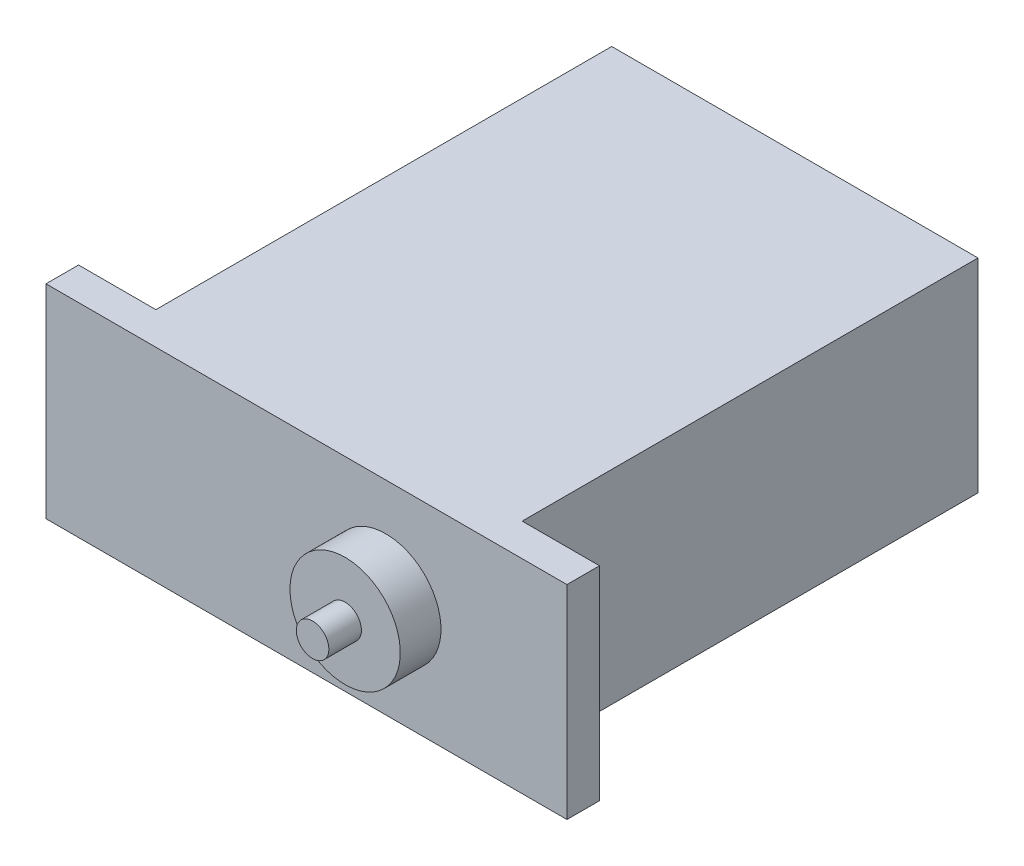
ISO-10303-21;
HEADER;
FILE_DESCRIPTION(('STEP AP214'),'2;1');
FILE_NAME('part.step','',(''),(''),'','','');
FILE_SCHEMA(('AUTOMOTIVE_DESIGN { 1 0 10303 214 1 1 1 1 }'));
ENDSEC;
DATA;
#1=APPLICATION_CONTEXT('core data for automotive mechanical design processes');
#2=APPLICATION_PROTOCOL_DEFINITION('international standard','automotive_design',2000,#1);
#3=PRODUCT_CONTEXT('',#1,'mechanical');
#4=PRODUCT('Part','Part','',(#3));
#5=PRODUCT_RELATED_PRODUCT_CATEGORY('part','',(#4));
#6=PRODUCT_DEFINITION_FORMATION('','',#4);
#7=PRODUCT_DEFINITION_CONTEXT('part definition',#1,'design');
#8=PRODUCT_DEFINITION('design','',#6,#7);
#9=PRODUCT_DEFINITION_SHAPE('','',#8);
#10=(LENGTH_UNIT() NAMED_UNIT(*) SI_UNIT(.MILLI.,.METRE.));
#11=(NAMED_UNIT(*) PLANE_ANGLE_UNIT() SI_UNIT($,.RADIAN.));
#12=(NAMED_UNIT(*) SI_UNIT($,.STERADIAN.) SOLID_ANGLE_UNIT());
#13=UNCERTAINTY_MEASURE_WITH_UNIT(LENGTH_MEASURE(1.E-05),#10,'distance_accuracy_value','');
#14=(GEOMETRIC_REPRESENTATION_CONTEXT(3) GLOBAL_UNCERTAINTY_ASSIGNED_CONTEXT((#13)) GLOBAL_UNIT_ASSIGNED_CONTEXT((#10,
#11,#12)) REPRESENTATION_CONTEXT('',''));
#15=CARTESIAN_POINT('',(0.,0.,0.));
#16=DIRECTION('',(0.,0.,1.));
#17=DIRECTION('',(1.,0.,0.));
#18=AXIS2_PLACEMENT_3D('',#15,#16,#17);
#19=CARTESIAN_POINT('',(11.25,6.25,28.));
#20=DIRECTION('',(-1.,0.,0.));
#21=DIRECTION('',(0.,-1.,0.));
#22=AXIS2_PLACEMENT_3D('',#19,#20,#21);
#23=PLANE('',#22);
#24=DIRECTION('',(0.,1.,0.));
#25=VECTOR('',#24,1.);
#26=CARTESIAN_POINT('',(11.25,6.25,0.));
#27=LINE('',#26,#25);
#28=CARTESIAN_POINT('',(11.25,-6.25,0.));
#29=VERTEX_POINT('',#28);
#30=CARTESIAN_POINT('',(11.25,6.25,0.));
#31=VERTEX_POINT('',#30);
#32=EDGE_CURVE('E144',#29,#31,#27,.T.);
#33=ORIENTED_EDGE('',*,*,#32,.T.);
#34=DIRECTION('',(0.,0.,-1.));
#35=VECTOR('',#34,1.);
#36=CARTESIAN_POINT('',(11.25,6.25,28.));
#37=LINE('',#36,#35);
#38=CARTESIAN_POINT('',(11.25,6.25,28.));
#39=VERTEX_POINT('',#38);
#40=EDGE_CURVE('E86',#39,#31,#37,.T.);
#41=ORIENTED_EDGE('',*,*,#40,.F.);
#42=DIRECTION('',(0.,1.,0.));
#43=VECTOR('',#42,1.);
#44=CARTESIAN_POINT('',(11.25,6.25,28.));
#45=LINE('',#44,#43);
#46=CARTESIAN_POINT('',(11.25,-6.25,28.));
#47=VERTEX_POINT('',#46);
#48=EDGE_CURVE('E154',#47,#39,#45,.T.);
#49=ORIENTED_EDGE('',*,*,#48,.F.);
#50=DIRECTION('',(0.,0.,-1.));
#51=VECTOR('',#50,1.);
#52=CARTESIAN_POINT('',(11.25,-6.25,28.));
#53=LINE('',#52,#51);
#54=EDGE_CURVE('E59',#47,#29,#53,.T.);
#55=ORIENTED_EDGE('',*,*,#54,.T.);
#56=EDGE_LOOP('',(#33,#41,#49,#55));
#57=FACE_BOUND('',#56,.T.);
#58=ADVANCED_FACE('F41',(#57),#23,.F.);
#59=CARTESIAN_POINT('',(-11.25,6.25,28.));
#60=DIRECTION('',(0.,-1.,0.));
#61=DIRECTION('',(0.,0.,-1.));
#62=AXIS2_PLACEMENT_3D('',#59,#60,#61);
#63=PLANE('',#62);
#64=DIRECTION('',(-1.,0.,0.));
#65=VECTOR('',#64,1.);
#66=CARTESIAN_POINT('',(-11.25,6.25,0.));
#67=LINE('',#66,#65);
#68=CARTESIAN_POINT('',(-11.25,6.25,0.));
#69=VERTEX_POINT('',#68);
#70=EDGE_CURVE('E148',#31,#69,#67,.T.);
#71=ORIENTED_EDGE('',*,*,#70,.T.);
#72=DIRECTION('',(0.,0.,-1.));
#73=VECTOR('',#72,1.);
#74=CARTESIAN_POINT('',(-11.25,6.25,28.));
#75=LINE('',#74,#73);
#76=CARTESIAN_POINT('',(-11.25,6.25,28.));
#77=VERTEX_POINT('',#76);
#78=EDGE_CURVE('E172',#77,#69,#75,.T.);
#79=ORIENTED_EDGE('',*,*,#78,.F.);
#80=DIRECTION('',(-1.,0.,0.));
#81=VECTOR('',#80,1.);
#82=CARTESIAN_POINT('',(-16.,6.25,28.));
#83=LINE('',#82,#81);
#84=CARTESIAN_POINT('',(-16.,6.25,28.));
#85=VERTEX_POINT('',#84);
#86=EDGE_CURVE('E209',#77,#85,#83,.T.);
#87=ORIENTED_EDGE('',*,*,#86,.T.);
#88=DIRECTION('',(0.,0.,-1.));
#89=VECTOR('',#88,1.);
#90=CARTESIAN_POINT('',(-16.,6.25,30.));
#91=LINE('',#90,#89);
#92=CARTESIAN_POINT('',(-16.,6.25,30.));
#93=VERTEX_POINT('',#92);
#94=EDGE_CURVE('E123',#93,#85,#91,.T.);
#95=ORIENTED_EDGE('',*,*,#94,.F.);
#96=DIRECTION('',(-1.,0.,0.));
#97=VECTOR('',#96,1.);
#98=CARTESIAN_POINT('',(-16.,6.25,30.));
#99=LINE('',#98,#97);
#100=CARTESIAN_POINT('',(16.,6.25,30.));
#101=VERTEX_POINT('',#100);
#102=EDGE_CURVE('E115',#101,#93,#99,.T.);
#103=ORIENTED_EDGE('',*,*,#102,.F.);
#104=DIRECTION('',(0.,0.,-1.));
#105=VECTOR('',#104,1.);
#106=CARTESIAN_POINT('',(16.,6.25,30.));
#107=LINE('',#106,#105);
#108=CARTESIAN_POINT('',(16.,6.25,28.));
#109=VERTEX_POINT('',#108);
#110=EDGE_CURVE('E120',#101,#109,#107,.T.);
#111=ORIENTED_EDGE('',*,*,#110,.T.);
#112=EDGE_CURVE('E212',#109,#39,#83,.T.);
#113=ORIENTED_EDGE('',*,*,#112,.T.);
#114=ORIENTED_EDGE('',*,*,#40,.T.);
#115=EDGE_LOOP('',(#71,#79,#87,#95,#103,#111,#113,#114));
#116=FACE_BOUND('',#115,.T.);
#117=ADVANCED_FACE('F117',(#116),#63,.F.);
#118=CARTESIAN_POINT('',(-11.25,6.25,28.));
#119=DIRECTION('',(1.,0.,0.));
#120=DIRECTION('',(0.,0.,-1.));
#121=AXIS2_PLACEMENT_3D('',#118,#119,#120);
#122=PLANE('',#121);
#123=DIRECTION('',(0.,-1.,0.));
#124=VECTOR('',#123,1.);
#125=CARTESIAN_POINT('',(-11.25,6.25,0.));
#126=LINE('',#125,#124);
#127=CARTESIAN_POINT('',(-11.25,-6.25,0.));
#128=VERTEX_POINT('',#127);
#129=EDGE_CURVE('E78',#69,#128,#126,.T.);
#130=ORIENTED_EDGE('',*,*,#129,.T.);
#131=DIRECTION('',(0.,0.,-1.));
#132=VECTOR('',#131,1.);
#133=CARTESIAN_POINT('',(-11.25,-6.25,28.));
#134=LINE('',#133,#132);
#135=CARTESIAN_POINT('',(-11.25,-6.25,28.));
#136=VERTEX_POINT('',#135);
#137=EDGE_CURVE('E169',#136,#128,#134,.T.);
#138=ORIENTED_EDGE('',*,*,#137,.F.);
#139=DIRECTION('',(0.,-1.,0.));
#140=VECTOR('',#139,1.);
#141=CARTESIAN_POINT('',(-11.25,6.25,28.));
#142=LINE('',#141,#140);
#143=EDGE_CURVE('E157',#77,#136,#142,.T.);
#144=ORIENTED_EDGE('',*,*,#143,.F.);
#145=ORIENTED_EDGE('',*,*,#78,.T.);
#146=EDGE_LOOP('',(#130,#138,#144,#145));
#147=FACE_BOUND('',#146,.T.);
#148=ADVANCED_FACE('F200',(#147),#122,.F.);
#149=CARTESIAN_POINT('',(-11.25,-6.25,28.));
#150=DIRECTION('',(0.,1.,0.));
#151=DIRECTION('',(0.,0.,1.));
#152=AXIS2_PLACEMENT_3D('',#149,#150,#151);
#153=PLANE('',#152);
#154=DIRECTION('',(1.,0.,0.));
#155=VECTOR('',#154,1.);
#156=CARTESIAN_POINT('',(-11.25,-6.25,0.));
#157=LINE('',#156,#155);
#158=EDGE_CURVE('E81',#128,#29,#157,.T.);
#159=ORIENTED_EDGE('',*,*,#158,.T.);
#160=ORIENTED_EDGE('',*,*,#54,.F.);
#161=DIRECTION('',(1.,0.,0.));
#162=VECTOR('',#161,1.);
#163=CARTESIAN_POINT('',(-16.,-6.25,28.));
#164=LINE('',#163,#162);
#165=CARTESIAN_POINT('',(16.,-6.25,28.));
#166=VERTEX_POINT('',#165);
#167=EDGE_CURVE('E222',#47,#166,#164,.T.);
#168=ORIENTED_EDGE('',*,*,#167,.T.);
#169=DIRECTION('',(0.,0.,-1.));
#170=VECTOR('',#169,1.);
#171=CARTESIAN_POINT('',(16.,-6.25,30.));
#172=LINE('',#171,#170);
#173=CARTESIAN_POINT('',(16.,-6.25,30.));
#174=VERTEX_POINT('',#173);
#175=EDGE_CURVE('E225',#174,#166,#172,.T.);
#176=ORIENTED_EDGE('',*,*,#175,.F.);
#177=DIRECTION('',(1.,0.,0.));
#178=VECTOR('',#177,1.);
#179=CARTESIAN_POINT('',(-16.,-6.25,30.));
#180=LINE('',#179,#178);
#181=CARTESIAN_POINT('',(-16.,-6.25,30.));
#182=VERTEX_POINT('',#181);
#183=EDGE_CURVE('E133',#182,#174,#180,.T.);
#184=ORIENTED_EDGE('',*,*,#183,.F.);
#185=DIRECTION('',(0.,0.,-1.));
#186=VECTOR('',#185,1.);
#187=CARTESIAN_POINT('',(-16.,-6.25,30.));
#188=LINE('',#187,#186);
#189=CARTESIAN_POINT('',(-16.,-6.25,28.));
#190=VERTEX_POINT('',#189);
#191=EDGE_CURVE('E150',#182,#190,#188,.T.);
#192=ORIENTED_EDGE('',*,*,#191,.T.);
#193=EDGE_CURVE('E138',#190,#136,#164,.T.);
#194=ORIENTED_EDGE('',*,*,#193,.T.);
#195=ORIENTED_EDGE('',*,*,#137,.T.);
#196=EDGE_LOOP('',(#159,#160,#168,#176,#184,#192,#194,#195));
#197=FACE_BOUND('',#196,.T.);
#198=ADVANCED_FACE('F230',(#197),#153,.F.);
#199=CARTESIAN_POINT('',(0.,0.,0.));
#200=DIRECTION('',(0.,0.,1.));
#201=DIRECTION('',(1.,0.,0.));
#202=AXIS2_PLACEMENT_3D('',#199,#200,#201);
#203=PLANE('',#202);
#204=ORIENTED_EDGE('',*,*,#32,.F.);
#205=ORIENTED_EDGE('',*,*,#158,.F.);
#206=ORIENTED_EDGE('',*,*,#129,.F.);
#207=ORIENTED_EDGE('',*,*,#70,.F.);
#208=EDGE_LOOP('',(#204,#205,#206,#207));
#209=FACE_BOUND('',#208,.T.);
#210=ADVANCED_FACE('F203',(#209),#203,.F.);
#211=CARTESIAN_POINT('',(0.,0.,28.));
#212=DIRECTION('',(0.,0.,-1.));
#213=DIRECTION('',(-1.,0.,0.));
#214=AXIS2_PLACEMENT_3D('',#211,#212,#213);
#215=PLANE('',#214);
#216=ORIENTED_EDGE('',*,*,#167,.F.);
#217=ORIENTED_EDGE('',*,*,#48,.T.);
#218=ORIENTED_EDGE('',*,*,#112,.F.);
#219=DIRECTION('',(0.,1.,0.));
#220=VECTOR('',#219,1.);
#221=CARTESIAN_POINT('',(16.,-6.25,28.));
#222=LINE('',#221,#220);
#223=EDGE_CURVE('E142',#166,#109,#222,.T.);
#224=ORIENTED_EDGE('',*,*,#223,.F.);
#225=EDGE_LOOP('',(#216,#217,#218,#224));
#226=FACE_BOUND('',#225,.T.);
#227=ADVANCED_FACE('F192',(#226),#215,.T.);
#228=CARTESIAN_POINT('',(16.,-6.25,30.));
#229=DIRECTION('',(-1.,0.,0.));
#230=DIRECTION('',(0.,0.,1.));
#231=AXIS2_PLACEMENT_3D('',#228,#229,#230);
#232=PLANE('',#231);
#233=ORIENTED_EDGE('',*,*,#223,.T.);
#234=ORIENTED_EDGE('',*,*,#110,.F.);
#235=DIRECTION('',(0.,1.,0.));
#236=VECTOR('',#235,1.);
#237=CARTESIAN_POINT('',(16.,-6.25,30.));
#238=LINE('',#237,#236);
#239=EDGE_CURVE('E128',#174,#101,#238,.T.);
#240=ORIENTED_EDGE('',*,*,#239,.F.);
#241=ORIENTED_EDGE('',*,*,#175,.T.);
#242=EDGE_LOOP('',(#233,#234,#240,#241));
#243=FACE_BOUND('',#242,.T.);
#244=ADVANCED_FACE('F140',(#243),#232,.F.);
#245=CARTESIAN_POINT('',(-16.,-6.25,30.));
#246=DIRECTION('',(1.,0.,0.));
#247=DIRECTION('',(0.,0.,-1.));
#248=AXIS2_PLACEMENT_3D('',#245,#246,#247);
#249=PLANE('',#248);
#250=DIRECTION('',(0.,-1.,0.));
#251=VECTOR('',#250,1.);
#252=CARTESIAN_POINT('',(-16.,-6.25,28.));
#253=LINE('',#252,#251);
#254=EDGE_CURVE('E210',#85,#190,#253,.T.);
#255=ORIENTED_EDGE('',*,*,#254,.T.);
#256=ORIENTED_EDGE('',*,*,#191,.F.);
#257=DIRECTION('',(0.,-1.,0.));
#258=VECTOR('',#257,1.);
#259=CARTESIAN_POINT('',(-16.,-6.25,30.));
#260=LINE('',#259,#258);
#261=EDGE_CURVE('E127',#93,#182,#260,.T.);
#262=ORIENTED_EDGE('',*,*,#261,.F.);
#263=ORIENTED_EDGE('',*,*,#94,.T.);
#264=EDGE_LOOP('',(#255,#256,#262,#263));
#265=FACE_BOUND('',#264,.T.);
#266=ADVANCED_FACE('F184',(#265),#249,.F.);
#267=CARTESIAN_POINT('',(0.,0.,30.));
#268=DIRECTION('',(0.,0.,-1.));
#269=DIRECTION('',(-1.,0.,0.));
#270=AXIS2_PLACEMENT_3D('',#267,#268,#269);
#271=PLANE('',#270);
#272=CARTESIAN_POINT('',(4.87431573936765,0.,30.));
#273=DIRECTION('',(0.,0.,-1.));
#274=DIRECTION('',(-1.,0.,0.));
#275=AXIS2_PLACEMENT_3D('',#272,#273,#274);
#276=CIRCLE('',#275,3.38865621209014);
#277=CARTESIAN_POINT('',(1.48565952727751,0.,30.));
#278=VERTEX_POINT('',#277);
#279=EDGE_CURVE('E44',#278,#278,#276,.F.);
#280=ORIENTED_EDGE('',*,*,#279,.F.);
#281=EDGE_LOOP('',(#280));
#282=FACE_BOUND('',#281,.T.);
#283=ORIENTED_EDGE('',*,*,#239,.T.);
#284=ORIENTED_EDGE('',*,*,#102,.T.);
#285=ORIENTED_EDGE('',*,*,#261,.T.);
#286=ORIENTED_EDGE('',*,*,#183,.T.);
#287=EDGE_LOOP('',(#283,#284,#285,#286));
#288=FACE_BOUND('',#287,.T.);
#289=ADVANCED_FACE('F131',(#282,#288),#271,.F.);
#290=ORIENTED_EDGE('',*,*,#86,.F.);
#291=ORIENTED_EDGE('',*,*,#143,.T.);
#292=ORIENTED_EDGE('',*,*,#193,.F.);
#293=ORIENTED_EDGE('',*,*,#254,.F.);
#294=EDGE_LOOP('',(#290,#291,#292,#293));
#295=FACE_BOUND('',#294,.T.);
#296=ADVANCED_FACE('F183',(#295),#215,.T.);
#297=CARTESIAN_POINT('',(4.87431573936765,0.,74.5845671467154));
#298=DIRECTION('',(0.,0.,-1.));
#299=DIRECTION('',(-1.,0.,0.));
#300=AXIS2_PLACEMENT_3D('',#297,#298,#299);
#301=CYLINDRICAL_SURFACE('',#300,3.38865621209014);
#302=CARTESIAN_POINT('',(4.87431573936765,0.,32.5));
#303=DIRECTION('',(0.,0.,1.));
#304=DIRECTION('',(1.,0.,0.));
#305=AXIS2_PLACEMENT_3D('',#302,#303,#304);
#306=CIRCLE('',#305,3.38865621209014);
#307=CARTESIAN_POINT('',(1.48565952727751,0.,32.5));
#308=VERTEX_POINT('',#307);
#309=EDGE_CURVE('E216',#308,#308,#306,.T.);
#310=CARTESIAN_POINT('',(1.48565952727751,0.,30.));
#311=CARTESIAN_POINT('',(1.48565952727751,0.,30.0260416666667));
#312=CARTESIAN_POINT('',(1.48565952727751,0.,30.0520833333333));
#313=CARTESIAN_POINT('',(1.48565952727751,0.,30.1041666666667));
#314=CARTESIAN_POINT('',(1.48565952727751,0.,30.1302083333333));
#315=CARTESIAN_POINT('',(1.48565952727751,0.,30.1822916666667));
#316=CARTESIAN_POINT('',(1.48565952727751,0.,30.2083333333333));
#317=CARTESIAN_POINT('',(1.48565952727751,0.,30.2604166666667));
#318=CARTESIAN_POINT('',(1.48565952727751,0.,30.2864583333333));
#319=CARTESIAN_POINT('',(1.48565952727751,0.,30.3385416666667));
#320=CARTESIAN_POINT('',(1.48565952727751,0.,30.3645833333333));
#321=CARTESIAN_POINT('',(1.48565952727751,0.,30.4166666666667));
#322=CARTESIAN_POINT('',(1.48565952727751,0.,30.4427083333333));
#323=CARTESIAN_POINT('',(1.48565952727751,0.,30.4947916666667));
#324=CARTESIAN_POINT('',(1.48565952727751,0.,30.5208333333333));
#325=CARTESIAN_POINT('',(1.48565952727751,0.,30.5729166666667));
#326=CARTESIAN_POINT('',(1.48565952727751,0.,30.5989583333333));
#327=CARTESIAN_POINT('',(1.48565952727751,0.,30.6510416666667));
#328=CARTESIAN_POINT('',(1.48565952727751,0.,30.6770833333333));
#329=CARTESIAN_POINT('',(1.48565952727751,0.,30.7291666666667));
#330=CARTESIAN_POINT('',(1.48565952727751,0.,30.7552083333333));
#331=CARTESIAN_POINT('',(1.48565952727751,0.,30.8072916666667));
#332=CARTESIAN_POINT('',(1.48565952727751,0.,30.8333333333333));
#333=CARTESIAN_POINT('',(1.48565952727751,0.,30.8854166666667));
#334=CARTESIAN_POINT('',(1.48565952727751,0.,30.9114583333333));
#335=CARTESIAN_POINT('',(1.48565952727751,0.,30.9635416666667));
#336=CARTESIAN_POINT('',(1.48565952727751,0.,30.9895833333333));
#337=CARTESIAN_POINT('',(1.48565952727751,0.,31.0416666666667));
#338=CARTESIAN_POINT('',(1.48565952727751,0.,31.0677083333333));
#339=CARTESIAN_POINT('',(1.48565952727751,0.,31.1197916666667));
#340=CARTESIAN_POINT('',(1.48565952727751,0.,31.1458333333333));
#341=CARTESIAN_POINT('',(1.48565952727751,0.,31.1979166666667));
#342=CARTESIAN_POINT('',(1.48565952727751,0.,31.2239583333333));
#343=CARTESIAN_POINT('',(1.48565952727751,0.,31.2760416666667));
#344=CARTESIAN_POINT('',(1.48565952727751,0.,31.3020833333333));
#345=CARTESIAN_POINT('',(1.48565952727751,0.,31.3541666666667));
#346=CARTESIAN_POINT('',(1.48565952727751,0.,31.3802083333333));
#347=CARTESIAN_POINT('',(1.48565952727751,0.,31.4322916666667));
#348=CARTESIAN_POINT('',(1.48565952727751,0.,31.4583333333333));
#349=CARTESIAN_POINT('',(1.48565952727751,0.,31.5104166666667));
#350=CARTESIAN_POINT('',(1.48565952727751,0.,31.5364583333333));
#351=CARTESIAN_POINT('',(1.48565952727751,0.,31.5885416666667));
#352=CARTESIAN_POINT('',(1.48565952727751,0.,31.6145833333333));
#353=CARTESIAN_POINT('',(1.48565952727751,0.,31.6666666666667));
#354=CARTESIAN_POINT('',(1.48565952727751,0.,31.6927083333333));
#355=CARTESIAN_POINT('',(1.48565952727751,0.,31.7447916666667));
#356=CARTESIAN_POINT('',(1.48565952727751,0.,31.7708333333333));
#357=CARTESIAN_POINT('',(1.48565952727751,0.,31.8229166666667));
#358=CARTESIAN_POINT('',(1.48565952727751,0.,31.8489583333333));
#359=CARTESIAN_POINT('',(1.48565952727751,0.,31.9010416666667));
#360=CARTESIAN_POINT('',(1.48565952727751,0.,31.9270833333333));
#361=CARTESIAN_POINT('',(1.48565952727751,0.,31.9791666666667));
#362=CARTESIAN_POINT('',(1.48565952727751,0.,32.0052083333333));
#363=CARTESIAN_POINT('',(1.48565952727751,0.,32.0572916666667));
#364=CARTESIAN_POINT('',(1.48565952727751,0.,32.0833333333333));
#365=CARTESIAN_POINT('',(1.48565952727751,0.,32.1354166666667));
#366=CARTESIAN_POINT('',(1.48565952727751,0.,32.1614583333333));
#367=CARTESIAN_POINT('',(1.48565952727751,0.,32.2135416666667));
#368=CARTESIAN_POINT('',(1.48565952727751,0.,32.2395833333333));
#369=CARTESIAN_POINT('',(1.48565952727751,0.,32.2916666666667));
#370=CARTESIAN_POINT('',(1.48565952727751,0.,32.3177083333333));
#371=CARTESIAN_POINT('',(1.48565952727751,0.,32.3697916666667));
#372=CARTESIAN_POINT('',(1.48565952727751,0.,32.3958333333333));
#373=CARTESIAN_POINT('',(1.48565952727751,0.,32.4479166666667));
#374=CARTESIAN_POINT('',(1.48565952727751,0.,32.4739583333333));
#375=CARTESIAN_POINT('',(1.48565952727751,0.,32.5));
#376=B_SPLINE_CURVE_WITH_KNOTS('',3,(#310,#311,#312,#313,#314,#315,#316,#317,#318,#319,#320,
#321,#322,#323,#324,#325,#326,#327,#328,#329,#330,#331,#332,#333,#334,#335,#336,#337,#338,#339,
#340,#341,#342,#343,#344,#345,#346,#347,#348,#349,#350,#351,#352,#353,#354,#355,#356,#357,#358,
#359,#360,#361,#362,#363,#364,#365,#366,#367,#368,#369,#370,#371,#372,#373,#374,#375),
.UNSPECIFIED.,.F.,.F.,(4,2,2,2,2,2,2,2,2,2,2,2,2,2,2,2,2,2,2,2,2,2,2,2,2,2,2,2,2,2,2,2,4),(0.,
0.0781249999999983,0.156249999999997,0.234375000000002,0.3125,0.390624999999999,
0.468749999999997,0.546874999999995,0.625000000000001,0.703124999999999,0.781249999999997,
0.859374999999996,0.937499999999994,1.01562499999999,1.09375,1.171875,1.24999999999999,
1.32812499999999,1.40624999999999,1.484375,1.56249999999999,1.64062499999999,1.71874999999999,
1.79687499999999,1.87499999999999,1.95312499999999,2.03124999999999,2.10937499999999,
2.18749999999999,2.26562499999999,2.34374999999999,2.42187499999999,2.49999999999999),.UNSPECIFIED.);
#377=EDGE_CURVE('BSEAM179',#278,#308,#376,.T.);
#378=ORIENTED_EDGE('',*,*,#279,.T.);
#379=ORIENTED_EDGE('',*,*,#309,.F.);
#380=ORIENTED_EDGE('',*,*,#377,.T.);
#381=ORIENTED_EDGE('',*,*,#377,.F.);
#382=EDGE_LOOP('',(#378,#380,#379,#381));
#383=FACE_BOUND('',#382,.T.);
#384=ADVANCED_FACE('F179',(#383),#301,.T.);
#385=CARTESIAN_POINT('',(0.,0.,32.5));
#386=DIRECTION('',(0.,0.,1.));
#387=DIRECTION('',(1.,0.,0.));
#388=AXIS2_PLACEMENT_3D('',#385,#386,#387);
#389=PLANE('',#388);
#390=CARTESIAN_POINT('',(4.87431573936765,0.,32.5));
#391=DIRECTION('',(0.,0.,1.));
#392=DIRECTION('',(1.,0.,0.));
#393=AXIS2_PLACEMENT_3D('',#390,#391,#392);
#394=CIRCLE('',#393,1.);
#395=CARTESIAN_POINT('',(5.87431573936765,0.,32.5));
#396=VERTEX_POINT('',#395);
#397=EDGE_CURVE('E12',#396,#396,#394,.T.);
#398=ORIENTED_EDGE('',*,*,#397,.F.);
#399=EDGE_LOOP('',(#398));
#400=FACE_BOUND('',#399,.T.);
#401=ORIENTED_EDGE('',*,*,#309,.T.);
#402=EDGE_LOOP('',(#401));
#403=FACE_BOUND('',#402,.T.);
#404=ADVANCED_FACE('F248',(#400,#403),#389,.T.);
#405=CARTESIAN_POINT('',(4.87431573936765,0.,34.5));
#406=DIRECTION('',(0.,0.,-1.));
#407=DIRECTION('',(-1.,0.,0.));
#408=AXIS2_PLACEMENT_3D('',#405,#406,#407);
#409=CYLINDRICAL_SURFACE('',#408,1.);
#410=CARTESIAN_POINT('',(4.87431573936765,0.,34.5));
#411=DIRECTION('',(0.,0.,1.));
#412=DIRECTION('',(1.,0.,0.));
#413=AXIS2_PLACEMENT_3D('',#410,#411,#412);
#414=CIRCLE('',#413,1.);
#415=CARTESIAN_POINT('',(5.87431573936765,0.,34.5));
#416=VERTEX_POINT('',#415);
#417=EDGE_CURVE('E237',#416,#416,#414,.T.);
#418=ORIENTED_EDGE('',*,*,#417,.F.);
#419=EDGE_LOOP('',(#418));
#420=FACE_BOUND('',#419,.T.);
#421=ORIENTED_EDGE('',*,*,#397,.T.);
#422=EDGE_LOOP('',(#421));
#423=FACE_BOUND('',#422,.T.);
#424=ADVANCED_FACE('F245',(#420,#423),#409,.T.);
#425=CARTESIAN_POINT('',(4.87431573936765,0.,34.5));
#426=DIRECTION('',(0.,0.,1.));
#427=DIRECTION('',(1.,0.,0.));
#428=AXIS2_PLACEMENT_3D('',#425,#426,#427);
#429=PLANE('',#428);
#430=ORIENTED_EDGE('',*,*,#417,.T.);
#431=EDGE_LOOP('',(#430));
#432=FACE_BOUND('',#431,.T.);
#433=ADVANCED_FACE('F243',(#432),#429,.T.);
#434=CLOSED_SHELL('',(#58,#117,#148,#198,#210,#227,#244,#266,#289,#296,#384,#404,#424,#433));
#435=MANIFOLD_SOLID_BREP('B2',#434);
#436=ADVANCED_BREP_SHAPE_REPRESENTATION('',(#18,#435),#14);
#437=SHAPE_DEFINITION_REPRESENTATION(#9,#436);
ENDSEC;
END-ISO-10303-21;
